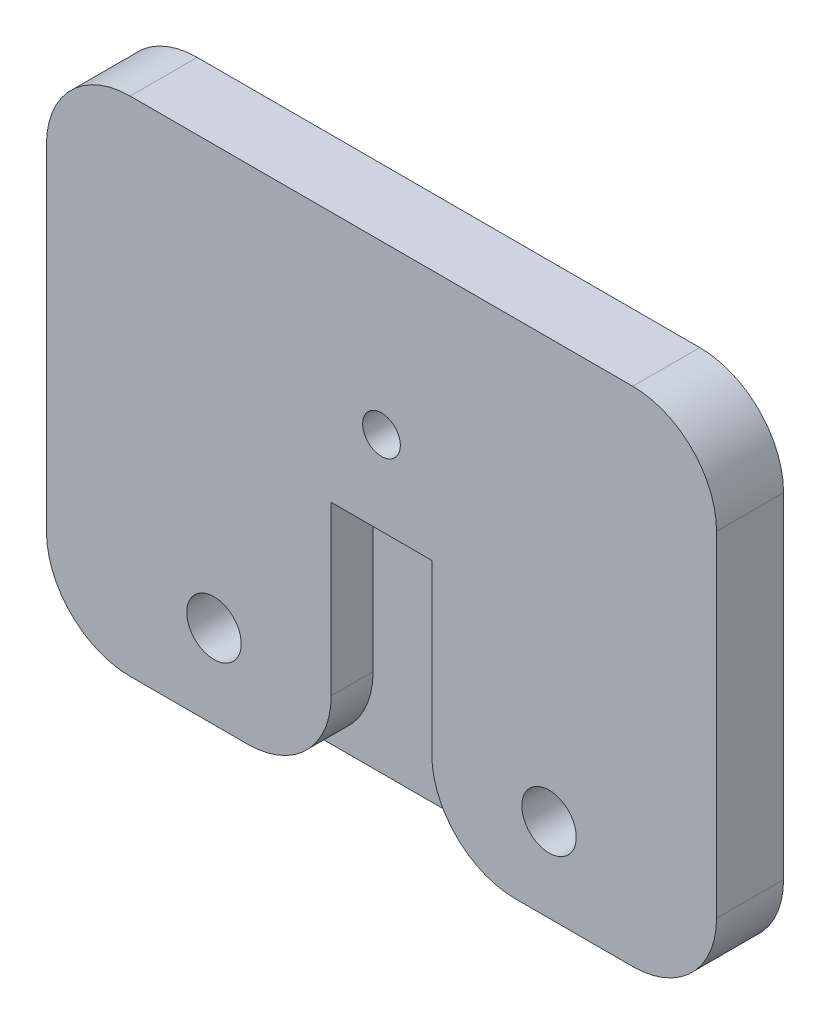
ISO-10303-21;
HEADER;
FILE_DESCRIPTION(('STEP AP214'),'2;1');
FILE_NAME('part.step','',(''),(''),'','','');
FILE_SCHEMA(('AUTOMOTIVE_DESIGN { 1 0 10303 214 1 1 1 1 }'));
ENDSEC;
DATA;
#1=APPLICATION_CONTEXT('core data for automotive mechanical design processes');
#2=APPLICATION_PROTOCOL_DEFINITION('international standard','automotive_design',2000,#1);
#3=PRODUCT_CONTEXT('',#1,'mechanical');
#4=PRODUCT('Part','Part','',(#3));
#5=PRODUCT_RELATED_PRODUCT_CATEGORY('part','',(#4));
#6=PRODUCT_DEFINITION_FORMATION('','',#4);
#7=PRODUCT_DEFINITION_CONTEXT('part definition',#1,'design');
#8=PRODUCT_DEFINITION('design','',#6,#7);
#9=PRODUCT_DEFINITION_SHAPE('','',#8);
#10=(LENGTH_UNIT() NAMED_UNIT(*) SI_UNIT(.MILLI.,.METRE.));
#11=(NAMED_UNIT(*) PLANE_ANGLE_UNIT() SI_UNIT($,.RADIAN.));
#12=(NAMED_UNIT(*) SI_UNIT($,.STERADIAN.) SOLID_ANGLE_UNIT());
#13=UNCERTAINTY_MEASURE_WITH_UNIT(LENGTH_MEASURE(1.E-05),#10,'distance_accuracy_value','');
#14=(GEOMETRIC_REPRESENTATION_CONTEXT(3) GLOBAL_UNCERTAINTY_ASSIGNED_CONTEXT((#13)) GLOBAL_UNIT_ASSIGNED_CONTEXT((#10,
#11,#12)) REPRESENTATION_CONTEXT('',''));
#15=CARTESIAN_POINT('',(0.,0.,0.));
#16=DIRECTION('',(0.,0.,1.));
#17=DIRECTION('',(1.,0.,0.));
#18=AXIS2_PLACEMENT_3D('',#15,#16,#17);
#19=CARTESIAN_POINT('',(0.,30.,8.));
#20=DIRECTION('',(0.,-1.,0.));
#21=DIRECTION('',(1.,0.,0.));
#22=AXIS2_PLACEMENT_3D('',#19,#20,#21);
#23=PLANE('',#22);
#24=DIRECTION('',(-1.,0.,0.));
#25=VECTOR('',#24,1.);
#26=CARTESIAN_POINT('',(0.,30.,0.));
#27=LINE('',#26,#25);
#28=CARTESIAN_POINT('',(29.9999999999999,30.,0.));
#29=VERTEX_POINT('',#28);
#30=CARTESIAN_POINT('',(-29.9999999999999,30.,0.));
#31=VERTEX_POINT('',#30);
#32=EDGE_CURVE('E218',#29,#31,#27,.T.);
#33=ORIENTED_EDGE('',*,*,#32,.T.);
#34=DIRECTION('',(0.,0.,-1.));
#35=VECTOR('',#34,1.);
#36=CARTESIAN_POINT('',(-29.9999999999999,30.,8.));
#37=LINE('',#36,#35);
#38=CARTESIAN_POINT('',(-29.9999999999999,30.,8.));
#39=VERTEX_POINT('',#38);
#40=EDGE_CURVE('E254',#39,#31,#37,.T.);
#41=ORIENTED_EDGE('',*,*,#40,.F.);
#42=DIRECTION('',(-1.,0.,0.));
#43=VECTOR('',#42,1.);
#44=CARTESIAN_POINT('',(0.,30.,8.));
#45=LINE('',#44,#43);
#46=CARTESIAN_POINT('',(29.9999999999999,30.,8.));
#47=VERTEX_POINT('',#46);
#48=EDGE_CURVE('E186',#47,#39,#45,.T.);
#49=ORIENTED_EDGE('',*,*,#48,.F.);
#50=DIRECTION('',(0.,0.,-1.));
#51=VECTOR('',#50,1.);
#52=CARTESIAN_POINT('',(29.9999999999999,30.,8.));
#53=LINE('',#52,#51);
#54=EDGE_CURVE('E212',#47,#29,#53,.T.);
#55=ORIENTED_EDGE('',*,*,#54,.T.);
#56=EDGE_LOOP('',(#33,#41,#49,#55));
#57=FACE_BOUND('',#56,.T.);
#58=ADVANCED_FACE('F39',(#57),#23,.F.);
#59=CARTESIAN_POINT('',(-30.,20.,8.));
#60=DIRECTION('',(0.,0.,-1.));
#61=DIRECTION('',(-1.,0.,0.));
#62=AXIS2_PLACEMENT_3D('',#59,#60,#61);
#63=CYLINDRICAL_SURFACE('',#62,10.);
#64=CARTESIAN_POINT('',(-30.,20.,0.));
#65=DIRECTION('',(0.,0.,1.));
#66=DIRECTION('',(1.,0.,0.));
#67=AXIS2_PLACEMENT_3D('',#64,#65,#66);
#68=CIRCLE('',#67,10.);
#69=CARTESIAN_POINT('',(-40.,19.9999999999999,0.));
#70=VERTEX_POINT('',#69);
#71=EDGE_CURVE('E221',#31,#70,#68,.T.);
#72=ORIENTED_EDGE('',*,*,#71,.T.);
#73=DIRECTION('',(0.,0.,-1.));
#74=VECTOR('',#73,1.);
#75=CARTESIAN_POINT('',(-40.,19.9999999999999,8.));
#76=LINE('',#75,#74);
#77=CARTESIAN_POINT('',(-40.,19.9999999999999,8.));
#78=VERTEX_POINT('',#77);
#79=EDGE_CURVE('E251',#78,#70,#76,.T.);
#80=ORIENTED_EDGE('',*,*,#79,.F.);
#81=CARTESIAN_POINT('',(-30.,20.,8.));
#82=DIRECTION('',(0.,0.,1.));
#83=DIRECTION('',(1.,0.,0.));
#84=AXIS2_PLACEMENT_3D('',#81,#82,#83);
#85=CIRCLE('',#84,10.);
#86=EDGE_CURVE('E189',#39,#78,#85,.T.);
#87=ORIENTED_EDGE('',*,*,#86,.F.);
#88=ORIENTED_EDGE('',*,*,#40,.T.);
#89=EDGE_LOOP('',(#72,#80,#87,#88));
#90=FACE_BOUND('',#89,.T.);
#91=ADVANCED_FACE('F308',(#90),#63,.T.);
#92=CARTESIAN_POINT('',(-40.,0.,8.));
#93=DIRECTION('',(1.,0.,0.));
#94=DIRECTION('',(0.,1.,0.));
#95=AXIS2_PLACEMENT_3D('',#92,#93,#94);
#96=PLANE('',#95);
#97=DIRECTION('',(0.,-1.,0.));
#98=VECTOR('',#97,1.);
#99=CARTESIAN_POINT('',(-40.,0.,0.));
#100=LINE('',#99,#98);
#101=CARTESIAN_POINT('',(-40.,-19.9999999999999,0.));
#102=VERTEX_POINT('',#101);
#103=EDGE_CURVE('E223',#70,#102,#100,.T.);
#104=ORIENTED_EDGE('',*,*,#103,.T.);
#105=DIRECTION('',(0.,0.,-1.));
#106=VECTOR('',#105,1.);
#107=CARTESIAN_POINT('',(-40.,-19.9999999999999,8.));
#108=LINE('',#107,#106);
#109=CARTESIAN_POINT('',(-40.,-19.9999999999999,8.));
#110=VERTEX_POINT('',#109);
#111=EDGE_CURVE('E249',#110,#102,#108,.T.);
#112=ORIENTED_EDGE('',*,*,#111,.F.);
#113=DIRECTION('',(0.,-1.,0.));
#114=VECTOR('',#113,1.);
#115=CARTESIAN_POINT('',(-40.,0.,8.));
#116=LINE('',#115,#114);
#117=EDGE_CURVE('E191',#78,#110,#116,.T.);
#118=ORIENTED_EDGE('',*,*,#117,.F.);
#119=ORIENTED_EDGE('',*,*,#79,.T.);
#120=EDGE_LOOP('',(#104,#112,#118,#119));
#121=FACE_BOUND('',#120,.T.);
#122=ADVANCED_FACE('F311',(#121),#96,.F.);
#123=CARTESIAN_POINT('',(-30.,-20.,8.));
#124=DIRECTION('',(0.,0.,-1.));
#125=DIRECTION('',(-1.,0.,0.));
#126=AXIS2_PLACEMENT_3D('',#123,#124,#125);
#127=CYLINDRICAL_SURFACE('',#126,10.);
#128=CARTESIAN_POINT('',(-30.,-20.,0.));
#129=DIRECTION('',(0.,0.,1.));
#130=DIRECTION('',(1.,0.,0.));
#131=AXIS2_PLACEMENT_3D('',#128,#129,#130);
#132=CIRCLE('',#131,10.);
#133=CARTESIAN_POINT('',(-29.9999999999999,-30.,0.));
#134=VERTEX_POINT('',#133);
#135=EDGE_CURVE('E226',#134,#102,#132,.F.);
#136=ORIENTED_EDGE('',*,*,#135,.F.);
#137=DIRECTION('',(0.,0.,-1.));
#138=VECTOR('',#137,1.);
#139=CARTESIAN_POINT('',(-29.9999999999999,-30.,8.));
#140=LINE('',#139,#138);
#141=CARTESIAN_POINT('',(-29.9999999999999,-30.,8.));
#142=VERTEX_POINT('',#141);
#143=EDGE_CURVE('E247',#142,#134,#140,.T.);
#144=ORIENTED_EDGE('',*,*,#143,.F.);
#145=CARTESIAN_POINT('',(-30.,-20.,8.));
#146=DIRECTION('',(0.,0.,1.));
#147=DIRECTION('',(1.,0.,0.));
#148=AXIS2_PLACEMENT_3D('',#145,#146,#147);
#149=CIRCLE('',#148,10.);
#150=EDGE_CURVE('E193',#142,#110,#149,.F.);
#151=ORIENTED_EDGE('',*,*,#150,.T.);
#152=ORIENTED_EDGE('',*,*,#111,.T.);
#153=EDGE_LOOP('',(#136,#144,#151,#152));
#154=FACE_BOUND('',#153,.T.);
#155=ADVANCED_FACE('F285',(#154),#127,.T.);
#156=CARTESIAN_POINT('',(0.,-30.,8.));
#157=DIRECTION('',(0.,-1.,0.));
#158=DIRECTION('',(1.,0.,0.));
#159=AXIS2_PLACEMENT_3D('',#156,#157,#158);
#160=PLANE('',#159);
#161=DIRECTION('',(1.,0.,0.));
#162=VECTOR('',#161,1.);
#163=CARTESIAN_POINT('',(-6.,-30.,3.));
#164=LINE('',#163,#162);
#165=CARTESIAN_POINT('',(-16.,-30.,3.));
#166=VERTEX_POINT('',#165);
#167=CARTESIAN_POINT('',(16.,-30.,3.));
#168=VERTEX_POINT('',#167);
#169=EDGE_CURVE('E155',#166,#168,#164,.T.);
#170=ORIENTED_EDGE('',*,*,#169,.F.);
#171=DIRECTION('',(0.,0.,1.));
#172=VECTOR('',#171,1.);
#173=CARTESIAN_POINT('',(-16.,-30.,8.));
#174=LINE('',#173,#172);
#175=CARTESIAN_POINT('',(-16.,-30.,8.));
#176=VERTEX_POINT('',#175);
#177=EDGE_CURVE('E260',#166,#176,#174,.T.);
#178=ORIENTED_EDGE('',*,*,#177,.T.);
#179=DIRECTION('',(-1.,0.,0.));
#180=VECTOR('',#179,1.);
#181=CARTESIAN_POINT('',(0.,-30.,8.));
#182=LINE('',#181,#180);
#183=EDGE_CURVE('E196',#176,#142,#182,.T.);
#184=ORIENTED_EDGE('',*,*,#183,.T.);
#185=ORIENTED_EDGE('',*,*,#143,.T.);
#186=DIRECTION('',(-1.,0.,0.));
#187=VECTOR('',#186,1.);
#188=CARTESIAN_POINT('',(0.,-30.,0.));
#189=LINE('',#188,#187);
#190=CARTESIAN_POINT('',(29.9999999999999,-30.,0.));
#191=VERTEX_POINT('',#190);
#192=EDGE_CURVE('E229',#191,#134,#189,.T.);
#193=ORIENTED_EDGE('',*,*,#192,.F.);
#194=DIRECTION('',(0.,0.,-1.));
#195=VECTOR('',#194,1.);
#196=CARTESIAN_POINT('',(29.9999999999999,-30.,8.));
#197=LINE('',#196,#195);
#198=CARTESIAN_POINT('',(29.9999999999999,-30.,8.));
#199=VERTEX_POINT('',#198);
#200=EDGE_CURVE('E245',#199,#191,#197,.T.);
#201=ORIENTED_EDGE('',*,*,#200,.F.);
#202=CARTESIAN_POINT('',(16.,-30.,8.));
#203=VERTEX_POINT('',#202);
#204=EDGE_CURVE('E197',#199,#203,#182,.T.);
#205=ORIENTED_EDGE('',*,*,#204,.T.);
#206=DIRECTION('',(0.,0.,1.));
#207=VECTOR('',#206,1.);
#208=CARTESIAN_POINT('',(16.,-30.,3.));
#209=LINE('',#208,#207);
#210=EDGE_CURVE('E257',#203,#168,#209,.F.);
#211=ORIENTED_EDGE('',*,*,#210,.T.);
#212=EDGE_LOOP('',(#170,#178,#184,#185,#193,#201,#205,#211));
#213=FACE_BOUND('',#212,.T.);
#214=ADVANCED_FACE('F275',(#213),#160,.T.);
#215=CARTESIAN_POINT('',(30.,-20.,8.));
#216=DIRECTION('',(0.,0.,-1.));
#217=DIRECTION('',(-1.,0.,0.));
#218=AXIS2_PLACEMENT_3D('',#215,#216,#217);
#219=CYLINDRICAL_SURFACE('',#218,10.);
#220=CARTESIAN_POINT('',(30.,-20.,0.));
#221=DIRECTION('',(0.,0.,1.));
#222=DIRECTION('',(1.,0.,0.));
#223=AXIS2_PLACEMENT_3D('',#220,#221,#222);
#224=CIRCLE('',#223,10.);
#225=CARTESIAN_POINT('',(40.,-19.9999999999999,0.));
#226=VERTEX_POINT('',#225);
#227=EDGE_CURVE('E232',#226,#191,#224,.F.);
#228=ORIENTED_EDGE('',*,*,#227,.F.);
#229=DIRECTION('',(0.,0.,-1.));
#230=VECTOR('',#229,1.);
#231=CARTESIAN_POINT('',(40.,-19.9999999999999,8.));
#232=LINE('',#231,#230);
#233=CARTESIAN_POINT('',(40.,-19.9999999999999,8.));
#234=VERTEX_POINT('',#233);
#235=EDGE_CURVE('E243',#234,#226,#232,.T.);
#236=ORIENTED_EDGE('',*,*,#235,.F.);
#237=CARTESIAN_POINT('',(30.,-20.,8.));
#238=DIRECTION('',(0.,0.,1.));
#239=DIRECTION('',(1.,0.,0.));
#240=AXIS2_PLACEMENT_3D('',#237,#238,#239);
#241=CIRCLE('',#240,10.);
#242=EDGE_CURVE('E200',#234,#199,#241,.F.);
#243=ORIENTED_EDGE('',*,*,#242,.T.);
#244=ORIENTED_EDGE('',*,*,#200,.T.);
#245=EDGE_LOOP('',(#228,#236,#243,#244));
#246=FACE_BOUND('',#245,.T.);
#247=ADVANCED_FACE('F294',(#246),#219,.T.);
#248=CARTESIAN_POINT('',(40.,0.,8.));
#249=DIRECTION('',(1.,0.,0.));
#250=DIRECTION('',(0.,1.,0.));
#251=AXIS2_PLACEMENT_3D('',#248,#249,#250);
#252=PLANE('',#251);
#253=DIRECTION('',(0.,-1.,0.));
#254=VECTOR('',#253,1.);
#255=CARTESIAN_POINT('',(40.,0.,0.));
#256=LINE('',#255,#254);
#257=CARTESIAN_POINT('',(40.,19.9999999999999,0.));
#258=VERTEX_POINT('',#257);
#259=EDGE_CURVE('E235',#258,#226,#256,.T.);
#260=ORIENTED_EDGE('',*,*,#259,.F.);
#261=DIRECTION('',(0.,0.,-1.));
#262=VECTOR('',#261,1.);
#263=CARTESIAN_POINT('',(40.,19.9999999999999,8.));
#264=LINE('',#263,#262);
#265=CARTESIAN_POINT('',(40.,19.9999999999999,8.));
#266=VERTEX_POINT('',#265);
#267=EDGE_CURVE('E241',#266,#258,#264,.T.);
#268=ORIENTED_EDGE('',*,*,#267,.F.);
#269=DIRECTION('',(0.,-1.,0.));
#270=VECTOR('',#269,1.);
#271=CARTESIAN_POINT('',(40.,0.,8.));
#272=LINE('',#271,#270);
#273=EDGE_CURVE('E203',#266,#234,#272,.T.);
#274=ORIENTED_EDGE('',*,*,#273,.T.);
#275=ORIENTED_EDGE('',*,*,#235,.T.);
#276=EDGE_LOOP('',(#260,#268,#274,#275));
#277=FACE_BOUND('',#276,.T.);
#278=ADVANCED_FACE('F299',(#277),#252,.T.);
#279=CARTESIAN_POINT('',(30.,20.,8.));
#280=DIRECTION('',(0.,0.,-1.));
#281=DIRECTION('',(-1.,0.,0.));
#282=AXIS2_PLACEMENT_3D('',#279,#280,#281);
#283=CYLINDRICAL_SURFACE('',#282,10.);
#284=CARTESIAN_POINT('',(30.,20.,0.));
#285=DIRECTION('',(0.,0.,1.));
#286=DIRECTION('',(1.,0.,0.));
#287=AXIS2_PLACEMENT_3D('',#284,#285,#286);
#288=CIRCLE('',#287,10.);
#289=EDGE_CURVE('E183',#29,#258,#288,.F.);
#290=ORIENTED_EDGE('',*,*,#289,.F.);
#291=ORIENTED_EDGE('',*,*,#54,.F.);
#292=CARTESIAN_POINT('',(30.,20.,8.));
#293=DIRECTION('',(0.,0.,1.));
#294=DIRECTION('',(1.,0.,0.));
#295=AXIS2_PLACEMENT_3D('',#292,#293,#294);
#296=CIRCLE('',#295,10.);
#297=EDGE_CURVE('E206',#47,#266,#296,.F.);
#298=ORIENTED_EDGE('',*,*,#297,.T.);
#299=ORIENTED_EDGE('',*,*,#267,.T.);
#300=EDGE_LOOP('',(#290,#291,#298,#299));
#301=FACE_BOUND('',#300,.T.);
#302=ADVANCED_FACE('F302',(#301),#283,.T.);
#303=CARTESIAN_POINT('',(20.,-20.,8.));
#304=DIRECTION('',(0.,0.,-1.));
#305=DIRECTION('',(-1.,0.,0.));
#306=AXIS2_PLACEMENT_3D('',#303,#304,#305);
#307=CYLINDRICAL_SURFACE('',#306,3.25);
#308=CARTESIAN_POINT('',(20.,-20.,8.));
#309=DIRECTION('',(0.,0.,1.));
#310=DIRECTION('',(1.,0.,0.));
#311=AXIS2_PLACEMENT_3D('',#308,#309,#310);
#312=CIRCLE('',#311,3.25);
#313=CARTESIAN_POINT('',(23.25,-20.,8.));
#314=VERTEX_POINT('',#313);
#315=EDGE_CURVE('E182',#314,#314,#312,.T.);
#316=ORIENTED_EDGE('',*,*,#315,.T.);
#317=EDGE_LOOP('',(#316));
#318=FACE_BOUND('',#317,.T.);
#319=CARTESIAN_POINT('',(20.,-20.,0.));
#320=DIRECTION('',(0.,0.,1.));
#321=DIRECTION('',(1.,0.,0.));
#322=AXIS2_PLACEMENT_3D('',#319,#320,#321);
#323=CIRCLE('',#322,3.25);
#324=CARTESIAN_POINT('',(23.25,-20.,0.));
#325=VERTEX_POINT('',#324);
#326=EDGE_CURVE('E215',#325,#325,#323,.T.);
#327=ORIENTED_EDGE('',*,*,#326,.F.);
#328=EDGE_LOOP('',(#327));
#329=FACE_BOUND('',#328,.T.);
#330=ADVANCED_FACE('F325',(#318,#329),#307,.F.);
#331=CARTESIAN_POINT('',(-20.,-20.,8.));
#332=DIRECTION('',(0.,0.,-1.));
#333=DIRECTION('',(-1.,0.,0.));
#334=AXIS2_PLACEMENT_3D('',#331,#332,#333);
#335=CYLINDRICAL_SURFACE('',#334,3.25);
#336=CARTESIAN_POINT('',(-20.,-20.,8.));
#337=DIRECTION('',(0.,0.,1.));
#338=DIRECTION('',(1.,0.,0.));
#339=AXIS2_PLACEMENT_3D('',#336,#337,#338);
#340=CIRCLE('',#339,3.25);
#341=CARTESIAN_POINT('',(-16.75,-20.,8.));
#342=VERTEX_POINT('',#341);
#343=EDGE_CURVE('E179',#342,#342,#340,.T.);
#344=ORIENTED_EDGE('',*,*,#343,.T.);
#345=EDGE_LOOP('',(#344));
#346=FACE_BOUND('',#345,.T.);
#347=CARTESIAN_POINT('',(-20.,-20.,0.));
#348=DIRECTION('',(0.,0.,1.));
#349=DIRECTION('',(1.,0.,0.));
#350=AXIS2_PLACEMENT_3D('',#347,#348,#349);
#351=CIRCLE('',#350,3.25);
#352=CARTESIAN_POINT('',(-16.75,-20.,0.));
#353=VERTEX_POINT('',#352);
#354=EDGE_CURVE('E176',#353,#353,#351,.T.);
#355=ORIENTED_EDGE('',*,*,#354,.F.);
#356=EDGE_LOOP('',(#355));
#357=FACE_BOUND('',#356,.T.);
#358=ADVANCED_FACE('F328',(#346,#357),#335,.F.);
#359=CARTESIAN_POINT('',(0.,10.,8.));
#360=DIRECTION('',(0.,0.,-1.));
#361=DIRECTION('',(-1.,0.,0.));
#362=AXIS2_PLACEMENT_3D('',#359,#360,#361);
#363=CYLINDRICAL_SURFACE('',#362,2.25);
#364=CARTESIAN_POINT('',(0.,10.,3.3));
#365=DIRECTION('',(0.,0.,1.));
#366=DIRECTION('',(1.,0.,0.));
#367=AXIS2_PLACEMENT_3D('',#364,#365,#366);
#368=CIRCLE('',#367,2.25);
#369=CARTESIAN_POINT('',(2.25,10.,3.3));
#370=VERTEX_POINT('',#369);
#371=EDGE_CURVE('E170',#370,#370,#368,.T.);
#372=ORIENTED_EDGE('',*,*,#371,.F.);
#373=EDGE_LOOP('',(#372));
#374=FACE_BOUND('',#373,.T.);
#375=CARTESIAN_POINT('',(0.,10.,8.));
#376=DIRECTION('',(0.,0.,1.));
#377=DIRECTION('',(1.,0.,0.));
#378=AXIS2_PLACEMENT_3D('',#375,#376,#377);
#379=CIRCLE('',#378,2.25);
#380=CARTESIAN_POINT('',(2.25,10.,8.));
#381=VERTEX_POINT('',#380);
#382=EDGE_CURVE('E209',#381,#381,#379,.T.);
#383=ORIENTED_EDGE('',*,*,#382,.T.);
#384=EDGE_LOOP('',(#383));
#385=FACE_BOUND('',#384,.T.);
#386=ADVANCED_FACE('F331',(#374,#385),#363,.F.);
#387=CARTESIAN_POINT('',(0.,0.,8.));
#388=DIRECTION('',(0.,0.,1.));
#389=DIRECTION('',(1.,0.,0.));
#390=AXIS2_PLACEMENT_3D('',#387,#388,#389);
#391=PLANE('',#390);
#392=ORIENTED_EDGE('',*,*,#183,.F.);
#393=CARTESIAN_POINT('',(-16.,-20.,8.));
#394=DIRECTION('',(0.,0.,1.));
#395=DIRECTION('',(1.,0.,0.));
#396=AXIS2_PLACEMENT_3D('',#393,#394,#395);
#397=CIRCLE('',#396,10.);
#398=CARTESIAN_POINT('',(-6.,-20.,8.));
#399=VERTEX_POINT('',#398);
#400=EDGE_CURVE('E265',#176,#399,#397,.T.);
#401=ORIENTED_EDGE('',*,*,#400,.T.);
#402=DIRECTION('',(0.,-1.,0.));
#403=VECTOR('',#402,1.);
#404=CARTESIAN_POINT('',(-6.,0.,8.));
#405=LINE('',#404,#403);
#406=CARTESIAN_POINT('',(-6.,0.,8.));
#407=VERTEX_POINT('',#406);
#408=EDGE_CURVE('E161',#407,#399,#405,.T.);
#409=ORIENTED_EDGE('',*,*,#408,.F.);
#410=DIRECTION('',(-1.,0.,0.));
#411=VECTOR('',#410,1.);
#412=CARTESIAN_POINT('',(6.00000000000001,0.,8.));
#413=LINE('',#412,#411);
#414=CARTESIAN_POINT('',(6.00000000000001,0.,8.));
#415=VERTEX_POINT('',#414);
#416=EDGE_CURVE('E146',#415,#407,#413,.T.);
#417=ORIENTED_EDGE('',*,*,#416,.F.);
#418=DIRECTION('',(0.,1.,0.));
#419=VECTOR('',#418,1.);
#420=CARTESIAN_POINT('',(6.00000000000001,-30.,8.));
#421=LINE('',#420,#419);
#422=CARTESIAN_POINT('',(6.00000000000001,-20.,8.));
#423=VERTEX_POINT('',#422);
#424=EDGE_CURVE('E159',#423,#415,#421,.T.);
#425=ORIENTED_EDGE('',*,*,#424,.F.);
#426=CARTESIAN_POINT('',(16.,-20.,8.));
#427=DIRECTION('',(0.,0.,1.));
#428=DIRECTION('',(1.,0.,0.));
#429=AXIS2_PLACEMENT_3D('',#426,#427,#428);
#430=CIRCLE('',#429,10.);
#431=EDGE_CURVE('E263',#423,#203,#430,.T.);
#432=ORIENTED_EDGE('',*,*,#431,.T.);
#433=ORIENTED_EDGE('',*,*,#204,.F.);
#434=ORIENTED_EDGE('',*,*,#242,.F.);
#435=ORIENTED_EDGE('',*,*,#273,.F.);
#436=ORIENTED_EDGE('',*,*,#297,.F.);
#437=ORIENTED_EDGE('',*,*,#48,.T.);
#438=ORIENTED_EDGE('',*,*,#86,.T.);
#439=ORIENTED_EDGE('',*,*,#117,.T.);
#440=ORIENTED_EDGE('',*,*,#150,.F.);
#441=EDGE_LOOP('',(#392,#401,#409,#417,#425,#432,#433,#434,#435,#436,#437,#438,#439,#440));
#442=FACE_BOUND('',#441,.T.);
#443=ORIENTED_EDGE('',*,*,#343,.F.);
#444=EDGE_LOOP('',(#443));
#445=FACE_BOUND('',#444,.T.);
#446=ORIENTED_EDGE('',*,*,#315,.F.);
#447=EDGE_LOOP('',(#446));
#448=FACE_BOUND('',#447,.T.);
#449=ORIENTED_EDGE('',*,*,#382,.F.);
#450=EDGE_LOOP('',(#449));
#451=FACE_BOUND('',#450,.T.);
#452=ADVANCED_FACE('F279',(#442,#445,#448,#451),#391,.T.);
#453=CARTESIAN_POINT('',(0.,0.,0.));
#454=DIRECTION('',(0.,0.,1.));
#455=DIRECTION('',(1.,0.,0.));
#456=AXIS2_PLACEMENT_3D('',#453,#454,#455);
#457=PLANE('',#456);
#458=CARTESIAN_POINT('',(0.,10.,0.));
#459=DIRECTION('',(0.,0.,1.));
#460=DIRECTION('',(1.,0.,0.));
#461=AXIS2_PLACEMENT_3D('',#458,#459,#460);
#462=CIRCLE('',#461,5.);
#463=CARTESIAN_POINT('',(5.,10.,0.));
#464=VERTEX_POINT('',#463);
#465=EDGE_CURVE('E168',#464,#464,#462,.T.);
#466=ORIENTED_EDGE('',*,*,#465,.T.);
#467=EDGE_LOOP('',(#466));
#468=FACE_BOUND('',#467,.T.);
#469=ORIENTED_EDGE('',*,*,#354,.T.);
#470=EDGE_LOOP('',(#469));
#471=FACE_BOUND('',#470,.T.);
#472=ORIENTED_EDGE('',*,*,#326,.T.);
#473=EDGE_LOOP('',(#472));
#474=FACE_BOUND('',#473,.T.);
#475=ORIENTED_EDGE('',*,*,#32,.F.);
#476=ORIENTED_EDGE('',*,*,#289,.T.);
#477=ORIENTED_EDGE('',*,*,#259,.T.);
#478=ORIENTED_EDGE('',*,*,#227,.T.);
#479=ORIENTED_EDGE('',*,*,#192,.T.);
#480=ORIENTED_EDGE('',*,*,#135,.T.);
#481=ORIENTED_EDGE('',*,*,#103,.F.);
#482=ORIENTED_EDGE('',*,*,#71,.F.);
#483=EDGE_LOOP('',(#475,#476,#477,#478,#479,#480,#481,#482));
#484=FACE_BOUND('',#483,.T.);
#485=ADVANCED_FACE('F291',(#468,#471,#474,#484),#457,.F.);
#486=CARTESIAN_POINT('',(0.,10.,3.3));
#487=DIRECTION('',(0.,0.,-1.));
#488=DIRECTION('',(-1.,0.,0.));
#489=AXIS2_PLACEMENT_3D('',#486,#487,#488);
#490=CYLINDRICAL_SURFACE('',#489,5.);
#491=CARTESIAN_POINT('',(0.,10.,3.3));
#492=DIRECTION('',(0.,0.,1.));
#493=DIRECTION('',(1.,0.,0.));
#494=AXIS2_PLACEMENT_3D('',#491,#492,#493);
#495=CIRCLE('',#494,5.);
#496=CARTESIAN_POINT('',(5.,10.,3.3));
#497=VERTEX_POINT('',#496);
#498=EDGE_CURVE('E173',#497,#497,#495,.T.);
#499=ORIENTED_EDGE('',*,*,#498,.T.);
#500=EDGE_LOOP('',(#499));
#501=FACE_BOUND('',#500,.T.);
#502=ORIENTED_EDGE('',*,*,#465,.F.);
#503=EDGE_LOOP('',(#502));
#504=FACE_BOUND('',#503,.T.);
#505=ADVANCED_FACE('F354',(#501,#504),#490,.F.);
#506=CARTESIAN_POINT('',(0.,0.,3.3));
#507=DIRECTION('',(0.,0.,1.));
#508=DIRECTION('',(1.,0.,0.));
#509=AXIS2_PLACEMENT_3D('',#506,#507,#508);
#510=PLANE('',#509);
#511=ORIENTED_EDGE('',*,*,#371,.T.);
#512=EDGE_LOOP('',(#511));
#513=FACE_BOUND('',#512,.T.);
#514=ORIENTED_EDGE('',*,*,#498,.F.);
#515=EDGE_LOOP('',(#514));
#516=FACE_BOUND('',#515,.T.);
#517=ADVANCED_FACE('F351',(#513,#516),#510,.F.);
#518=CARTESIAN_POINT('',(6.00000000000001,0.,3.));
#519=DIRECTION('',(0.,1.,0.));
#520=DIRECTION('',(0.,0.,1.));
#521=AXIS2_PLACEMENT_3D('',#518,#519,#520);
#522=PLANE('',#521);
#523=ORIENTED_EDGE('',*,*,#416,.T.);
#524=DIRECTION('',(0.,0.,1.));
#525=VECTOR('',#524,1.);
#526=CARTESIAN_POINT('',(-6.,0.,3.));
#527=LINE('',#526,#525);
#528=CARTESIAN_POINT('',(-6.,0.,3.));
#529=VERTEX_POINT('',#528);
#530=EDGE_CURVE('E140',#529,#407,#527,.T.);
#531=ORIENTED_EDGE('',*,*,#530,.F.);
#532=DIRECTION('',(-1.,0.,0.));
#533=VECTOR('',#532,1.);
#534=CARTESIAN_POINT('',(6.00000000000001,0.,3.));
#535=LINE('',#534,#533);
#536=CARTESIAN_POINT('',(6.00000000000001,0.,3.));
#537=VERTEX_POINT('',#536);
#538=EDGE_CURVE('E144',#537,#529,#535,.T.);
#539=ORIENTED_EDGE('',*,*,#538,.F.);
#540=DIRECTION('',(0.,0.,1.));
#541=VECTOR('',#540,1.);
#542=CARTESIAN_POINT('',(6.00000000000001,0.,3.));
#543=LINE('',#542,#541);
#544=EDGE_CURVE('E148',#537,#415,#543,.T.);
#545=ORIENTED_EDGE('',*,*,#544,.T.);
#546=EDGE_LOOP('',(#523,#531,#539,#545));
#547=FACE_BOUND('',#546,.T.);
#548=ADVANCED_FACE('F141',(#547),#522,.F.);
#549=CARTESIAN_POINT('',(6.00000000000001,-30.,3.));
#550=DIRECTION('',(1.,0.,0.));
#551=DIRECTION('',(0.,0.,-1.));
#552=AXIS2_PLACEMENT_3D('',#549,#550,#551);
#553=PLANE('',#552);
#554=DIRECTION('',(0.,1.,0.));
#555=VECTOR('',#554,1.);
#556=CARTESIAN_POINT('',(6.00000000000001,-30.,3.));
#557=LINE('',#556,#555);
#558=CARTESIAN_POINT('',(6.00000000000001,-20.,3.));
#559=VERTEX_POINT('',#558);
#560=EDGE_CURVE('E149',#559,#537,#557,.T.);
#561=ORIENTED_EDGE('',*,*,#560,.F.);
#562=DIRECTION('',(0.,0.,1.));
#563=VECTOR('',#562,1.);
#564=CARTESIAN_POINT('',(6.00000000000001,-20.,8.));
#565=LINE('',#564,#563);
#566=EDGE_CURVE('E268',#559,#423,#565,.T.);
#567=ORIENTED_EDGE('',*,*,#566,.T.);
#568=ORIENTED_EDGE('',*,*,#424,.T.);
#569=ORIENTED_EDGE('',*,*,#544,.F.);
#570=EDGE_LOOP('',(#561,#567,#568,#569));
#571=FACE_BOUND('',#570,.T.);
#572=ADVANCED_FACE('F343',(#571),#553,.F.);
#573=CARTESIAN_POINT('',(-6.,0.,3.));
#574=DIRECTION('',(-1.,0.,0.));
#575=DIRECTION('',(0.,0.,1.));
#576=AXIS2_PLACEMENT_3D('',#573,#574,#575);
#577=PLANE('',#576);
#578=ORIENTED_EDGE('',*,*,#408,.T.);
#579=DIRECTION('',(0.,0.,1.));
#580=VECTOR('',#579,1.);
#581=CARTESIAN_POINT('',(-6.,-20.,3.));
#582=LINE('',#581,#580);
#583=CARTESIAN_POINT('',(-6.,-20.,3.));
#584=VERTEX_POINT('',#583);
#585=EDGE_CURVE('E60',#399,#584,#582,.F.);
#586=ORIENTED_EDGE('',*,*,#585,.T.);
#587=DIRECTION('',(0.,-1.,0.));
#588=VECTOR('',#587,1.);
#589=CARTESIAN_POINT('',(-6.,0.,3.));
#590=LINE('',#589,#588);
#591=EDGE_CURVE('E151',#529,#584,#590,.T.);
#592=ORIENTED_EDGE('',*,*,#591,.F.);
#593=ORIENTED_EDGE('',*,*,#530,.T.);
#594=EDGE_LOOP('',(#578,#586,#592,#593));
#595=FACE_BOUND('',#594,.T.);
#596=ADVANCED_FACE('F152',(#595),#577,.F.);
#597=CARTESIAN_POINT('',(0.,0.,3.));
#598=DIRECTION('',(0.,0.,1.));
#599=DIRECTION('',(1.,0.,0.));
#600=AXIS2_PLACEMENT_3D('',#597,#598,#599);
#601=PLANE('',#600);
#602=ORIENTED_EDGE('',*,*,#538,.T.);
#603=ORIENTED_EDGE('',*,*,#591,.T.);
#604=CARTESIAN_POINT('',(-16.,-20.,3.));
#605=DIRECTION('',(0.,0.,1.));
#606=DIRECTION('',(1.,0.,0.));
#607=AXIS2_PLACEMENT_3D('',#604,#605,#606);
#608=CIRCLE('',#607,10.);
#609=EDGE_CURVE('E47',#584,#166,#608,.F.);
#610=ORIENTED_EDGE('',*,*,#609,.T.);
#611=ORIENTED_EDGE('',*,*,#169,.T.);
#612=CARTESIAN_POINT('',(16.,-20.,3.));
#613=DIRECTION('',(0.,0.,1.));
#614=DIRECTION('',(1.,0.,0.));
#615=AXIS2_PLACEMENT_3D('',#612,#613,#614);
#616=CIRCLE('',#615,10.);
#617=EDGE_CURVE('E11',#168,#559,#616,.F.);
#618=ORIENTED_EDGE('',*,*,#617,.T.);
#619=ORIENTED_EDGE('',*,*,#560,.T.);
#620=EDGE_LOOP('',(#602,#603,#610,#611,#618,#619));
#621=FACE_BOUND('',#620,.T.);
#622=ADVANCED_FACE('F157',(#621),#601,.T.);
#623=CARTESIAN_POINT('',(-16.,-20.,8.));
#624=DIRECTION('',(0.,0.,-1.));
#625=DIRECTION('',(-1.,0.,0.));
#626=AXIS2_PLACEMENT_3D('',#623,#624,#625);
#627=CYLINDRICAL_SURFACE('',#626,10.);
#628=ORIENTED_EDGE('',*,*,#609,.F.);
#629=ORIENTED_EDGE('',*,*,#585,.F.);
#630=ORIENTED_EDGE('',*,*,#400,.F.);
#631=ORIENTED_EDGE('',*,*,#177,.F.);
#632=EDGE_LOOP('',(#628,#629,#630,#631));
#633=FACE_BOUND('',#632,.T.);
#634=ADVANCED_FACE('F272',(#633),#627,.T.);
#635=CARTESIAN_POINT('',(16.,-20.,3.));
#636=DIRECTION('',(0.,0.,-1.));
#637=DIRECTION('',(-1.,0.,0.));
#638=AXIS2_PLACEMENT_3D('',#635,#636,#637);
#639=CYLINDRICAL_SURFACE('',#638,10.);
#640=ORIENTED_EDGE('',*,*,#617,.F.);
#641=ORIENTED_EDGE('',*,*,#210,.F.);
#642=ORIENTED_EDGE('',*,*,#431,.F.);
#643=ORIENTED_EDGE('',*,*,#566,.F.);
#644=EDGE_LOOP('',(#640,#641,#642,#643));
#645=FACE_BOUND('',#644,.T.);
#646=ADVANCED_FACE('F41',(#645),#639,.T.);
#647=CLOSED_SHELL('',(#58,#91,#122,#155,#214,#247,#278,#302,#330,#358,#386,#452,#485,#505,#517,
#548,#572,#596,#622,#634,#646));
#648=MANIFOLD_SOLID_BREP('B2',#647);
#649=ADVANCED_BREP_SHAPE_REPRESENTATION('',(#18,#648),#14);
#650=SHAPE_DEFINITION_REPRESENTATION(#9,#649);
ENDSEC;
END-ISO-10303-21;
